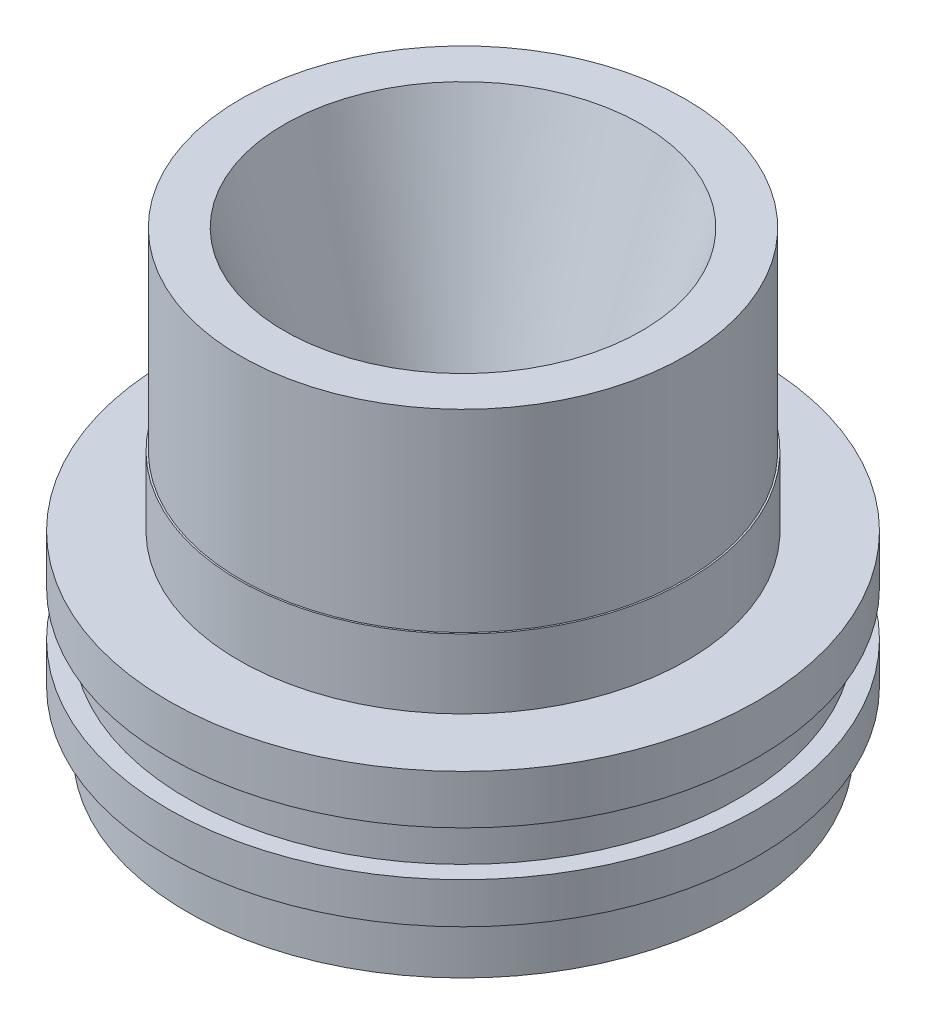
ISO-10303-21;
HEADER;
FILE_DESCRIPTION(('STEP AP214'),'2;1');
FILE_NAME('part.step','',(''),(''),'','','');
FILE_SCHEMA(('AUTOMOTIVE_DESIGN { 1 0 10303 214 1 1 1 1 }'));
ENDSEC;
DATA;
#1=APPLICATION_CONTEXT('core data for automotive mechanical design processes');
#2=APPLICATION_PROTOCOL_DEFINITION('international standard','automotive_design',2000,#1);
#3=PRODUCT_CONTEXT('',#1,'mechanical');
#4=PRODUCT('Part','Part','',(#3));
#5=PRODUCT_RELATED_PRODUCT_CATEGORY('part','',(#4));
#6=PRODUCT_DEFINITION_FORMATION('','',#4);
#7=PRODUCT_DEFINITION_CONTEXT('part definition',#1,'design');
#8=PRODUCT_DEFINITION('design','',#6,#7);
#9=PRODUCT_DEFINITION_SHAPE('','',#8);
#10=(LENGTH_UNIT() NAMED_UNIT(*) SI_UNIT(.MILLI.,.METRE.));
#11=(NAMED_UNIT(*) PLANE_ANGLE_UNIT() SI_UNIT($,.RADIAN.));
#12=(NAMED_UNIT(*) SI_UNIT($,.STERADIAN.) SOLID_ANGLE_UNIT());
#13=UNCERTAINTY_MEASURE_WITH_UNIT(LENGTH_MEASURE(1.E-05),#10,'distance_accuracy_value','');
#14=(GEOMETRIC_REPRESENTATION_CONTEXT(3) GLOBAL_UNCERTAINTY_ASSIGNED_CONTEXT((#13)) GLOBAL_UNIT_ASSIGNED_CONTEXT((#10,
#11,#12)) REPRESENTATION_CONTEXT('',''));
#15=CARTESIAN_POINT('',(0.,0.,0.));
#16=DIRECTION('',(0.,0.,1.));
#17=DIRECTION('',(1.,0.,0.));
#18=AXIS2_PLACEMENT_3D('',#15,#16,#17);
#19=CARTESIAN_POINT('',(0.,0.,0.));
#20=DIRECTION('',(0.,-1.,0.));
#21=DIRECTION('',(0.,0.,-1.));
#22=AXIS2_PLACEMENT_3D('',#19,#20,#21);
#23=CYLINDRICAL_SURFACE('',#22,42.926);
#24=CARTESIAN_POINT('',(0.,-57.9125072160261,0.));
#25=DIRECTION('',(0.,-1.,0.));
#26=DIRECTION('',(0.,0.,-1.));
#27=AXIS2_PLACEMENT_3D('',#24,#25,#26);
#28=CIRCLE('',#27,42.926);
#29=CARTESIAN_POINT('',(0.,-57.9125072160261,-42.926));
#30=VERTEX_POINT('',#29);
#31=EDGE_CURVE('E10',#30,#30,#28,.T.);
#32=ORIENTED_EDGE('',*,*,#31,.F.);
#33=EDGE_LOOP('',(#32));
#34=FACE_BOUND('',#33,.T.);
#35=CARTESIAN_POINT('',(0.,-48.9463072160261,0.));
#36=DIRECTION('',(0.,-1.,0.));
#37=DIRECTION('',(0.,0.,-1.));
#38=AXIS2_PLACEMENT_3D('',#35,#36,#37);
#39=CIRCLE('',#38,42.926);
#40=CARTESIAN_POINT('',(0.,-48.9463072160261,-42.926));
#41=VERTEX_POINT('',#40);
#42=EDGE_CURVE('E88',#41,#41,#39,.T.);
#43=ORIENTED_EDGE('',*,*,#42,.T.);
#44=EDGE_LOOP('',(#43));
#45=FACE_BOUND('',#44,.T.);
#46=ADVANCED_FACE('F34',(#34,#45),#23,.T.);
#47=CARTESIAN_POINT('',(-40.513,-57.9125072160261,0.));
#48=DIRECTION('',(0.,1.,0.));
#49=DIRECTION('',(0.,0.,1.));
#50=AXIS2_PLACEMENT_3D('',#47,#48,#49);
#51=PLANE('',#50);
#52=CARTESIAN_POINT('',(0.,-57.9125072160261,0.));
#53=DIRECTION('',(0.,-1.,0.));
#54=DIRECTION('',(0.,0.,-1.));
#55=AXIS2_PLACEMENT_3D('',#52,#53,#54);
#56=CIRCLE('',#55,40.513);
#57=CARTESIAN_POINT('',(0.,-57.9125072160261,-40.513));
#58=VERTEX_POINT('',#57);
#59=EDGE_CURVE('E40',#58,#58,#56,.T.);
#60=ORIENTED_EDGE('',*,*,#59,.F.);
#61=EDGE_LOOP('',(#60));
#62=FACE_BOUND('',#61,.T.);
#63=ORIENTED_EDGE('',*,*,#31,.T.);
#64=EDGE_LOOP('',(#63));
#65=FACE_BOUND('',#64,.T.);
#66=ADVANCED_FACE('F173',(#62,#65),#51,.F.);
#67=CARTESIAN_POINT('',(0.,-57.9125072160261,0.));
#68=DIRECTION('',(0.,-1.,0.));
#69=DIRECTION('',(0.,0.,-1.));
#70=AXIS2_PLACEMENT_3D('',#67,#68,#69);
#71=CONICAL_SURFACE('',#70,40.513,1.09589215761104);
#72=CARTESIAN_POINT('',(0.,-44.0695072160261,0.));
#73=DIRECTION('',(0.,-1.,0.));
#74=DIRECTION('',(0.,0.,-1.));
#75=AXIS2_PLACEMENT_3D('',#72,#73,#74);
#76=CIRCLE('',#75,13.589);
#77=CARTESIAN_POINT('',(0.,-44.0695072160261,-13.589));
#78=VERTEX_POINT('',#77);
#79=EDGE_CURVE('E44',#78,#78,#76,.T.);
#80=ORIENTED_EDGE('',*,*,#79,.F.);
#81=EDGE_LOOP('',(#80));
#82=FACE_BOUND('',#81,.T.);
#83=ORIENTED_EDGE('',*,*,#59,.T.);
#84=EDGE_LOOP('',(#83));
#85=FACE_BOUND('',#84,.T.);
#86=ADVANCED_FACE('F168',(#82,#85),#71,.F.);
#87=CARTESIAN_POINT('',(0.,0.,0.));
#88=DIRECTION('',(0.,-1.,0.));
#89=DIRECTION('',(0.,0.,-1.));
#90=AXIS2_PLACEMENT_3D('',#87,#88,#89);
#91=CYLINDRICAL_SURFACE('',#90,13.589);
#92=CARTESIAN_POINT('',(0.,-31.3695072160261,0.));
#93=DIRECTION('',(0.,-1.,0.));
#94=DIRECTION('',(0.,0.,-1.));
#95=AXIS2_PLACEMENT_3D('',#92,#93,#94);
#96=CIRCLE('',#95,13.589);
#97=CARTESIAN_POINT('',(0.,-31.3695072160261,-13.589));
#98=VERTEX_POINT('',#97);
#99=EDGE_CURVE('E48',#98,#98,#96,.T.);
#100=ORIENTED_EDGE('',*,*,#99,.F.);
#101=EDGE_LOOP('',(#100));
#102=FACE_BOUND('',#101,.T.);
#103=ORIENTED_EDGE('',*,*,#79,.T.);
#104=EDGE_LOOP('',(#103));
#105=FACE_BOUND('',#104,.T.);
#106=ADVANCED_FACE('F162',(#102,#105),#91,.F.);
#107=CARTESIAN_POINT('',(0.,-31.3695072160261,0.));
#108=DIRECTION('',(0.,1.,0.));
#109=DIRECTION('',(0.,0.,1.));
#110=AXIS2_PLACEMENT_3D('',#107,#108,#109);
#111=CONICAL_SURFACE('',#110,13.589,0.311294124886036);
#112=CARTESIAN_POINT('',(0.,12.9026927839739,0.));
#113=DIRECTION('',(0.,-1.,0.));
#114=DIRECTION('',(0.,0.,-1.));
#115=AXIS2_PLACEMENT_3D('',#112,#113,#114);
#116=CIRCLE('',#115,27.8338022557719);
#117=CARTESIAN_POINT('',(0.,12.9026927839739,-27.8338022557719));
#118=VERTEX_POINT('',#117);
#119=EDGE_CURVE('E53',#118,#118,#116,.T.);
#120=ORIENTED_EDGE('',*,*,#119,.F.);
#121=EDGE_LOOP('',(#120));
#122=FACE_BOUND('',#121,.T.);
#123=ORIENTED_EDGE('',*,*,#99,.T.);
#124=EDGE_LOOP('',(#123));
#125=FACE_BOUND('',#124,.T.);
#126=ADVANCED_FACE('F156',(#122,#125),#111,.F.);
#127=CARTESIAN_POINT('',(-34.6456,12.9026927839739,0.));
#128=DIRECTION('',(0.,-1.,0.));
#129=DIRECTION('',(0.,0.,-1.));
#130=AXIS2_PLACEMENT_3D('',#127,#128,#129);
#131=PLANE('',#130);
#132=CARTESIAN_POINT('',(0.,12.9026927839739,0.));
#133=DIRECTION('',(0.,-1.,0.));
#134=DIRECTION('',(0.,0.,-1.));
#135=AXIS2_PLACEMENT_3D('',#132,#133,#134);
#136=CIRCLE('',#135,34.6456);
#137=CARTESIAN_POINT('',(0.,12.9026927839739,-34.6456));
#138=VERTEX_POINT('',#137);
#139=EDGE_CURVE('E57',#138,#138,#136,.T.);
#140=ORIENTED_EDGE('',*,*,#139,.F.);
#141=EDGE_LOOP('',(#140));
#142=FACE_BOUND('',#141,.T.);
#143=ORIENTED_EDGE('',*,*,#119,.T.);
#144=EDGE_LOOP('',(#143));
#145=FACE_BOUND('',#144,.T.);
#146=ADVANCED_FACE('F150',(#142,#145),#131,.F.);
#147=CARTESIAN_POINT('',(0.,0.,0.));
#148=DIRECTION('',(0.,-1.,0.));
#149=DIRECTION('',(0.,0.,-1.));
#150=AXIS2_PLACEMENT_3D('',#147,#148,#149);
#151=CYLINDRICAL_SURFACE('',#150,34.6456);
#152=CARTESIAN_POINT('',(0.,-17.1963072160261,0.));
#153=DIRECTION('',(0.,-1.,0.));
#154=DIRECTION('',(0.,0.,-1.));
#155=AXIS2_PLACEMENT_3D('',#152,#153,#154);
#156=CIRCLE('',#155,34.6456);
#157=CARTESIAN_POINT('',(0.,-17.1963072160261,-34.6456));
#158=VERTEX_POINT('',#157);
#159=EDGE_CURVE('E61',#158,#158,#156,.T.);
#160=ORIENTED_EDGE('',*,*,#159,.F.);
#161=EDGE_LOOP('',(#160));
#162=FACE_BOUND('',#161,.T.);
#163=ORIENTED_EDGE('',*,*,#139,.T.);
#164=EDGE_LOOP('',(#163));
#165=FACE_BOUND('',#164,.T.);
#166=ADVANCED_FACE('F144',(#162,#165),#151,.T.);
#167=CARTESIAN_POINT('',(-34.8996,-17.1963072160261,0.));
#168=DIRECTION('',(0.,-1.,0.));
#169=DIRECTION('',(0.,0.,-1.));
#170=AXIS2_PLACEMENT_3D('',#167,#168,#169);
#171=PLANE('',#170);
#172=CARTESIAN_POINT('',(0.,-17.1963072160261,0.));
#173=DIRECTION('',(0.,-1.,0.));
#174=DIRECTION('',(0.,0.,-1.));
#175=AXIS2_PLACEMENT_3D('',#172,#173,#174);
#176=CIRCLE('',#175,34.8996);
#177=CARTESIAN_POINT('',(0.,-17.1963072160261,-34.8996));
#178=VERTEX_POINT('',#177);
#179=EDGE_CURVE('E64',#178,#178,#176,.T.);
#180=ORIENTED_EDGE('',*,*,#179,.F.);
#181=EDGE_LOOP('',(#180));
#182=FACE_BOUND('',#181,.T.);
#183=ORIENTED_EDGE('',*,*,#159,.T.);
#184=EDGE_LOOP('',(#183));
#185=FACE_BOUND('',#184,.T.);
#186=ADVANCED_FACE('F138',(#182,#185),#171,.F.);
#187=CARTESIAN_POINT('',(0.,0.,0.));
#188=DIRECTION('',(0.,-1.,0.));
#189=DIRECTION('',(0.,0.,-1.));
#190=AXIS2_PLACEMENT_3D('',#187,#188,#189);
#191=CYLINDRICAL_SURFACE('',#190,34.8996);
#192=CARTESIAN_POINT('',(0.,-27.9913072160261,0.));
#193=DIRECTION('',(0.,-1.,0.));
#194=DIRECTION('',(0.,0.,-1.));
#195=AXIS2_PLACEMENT_3D('',#192,#193,#194);
#196=CIRCLE('',#195,34.8996);
#197=CARTESIAN_POINT('',(0.,-27.9913072160261,-34.8996));
#198=VERTEX_POINT('',#197);
#199=EDGE_CURVE('E67',#198,#198,#196,.T.);
#200=ORIENTED_EDGE('',*,*,#199,.F.);
#201=EDGE_LOOP('',(#200));
#202=FACE_BOUND('',#201,.T.);
#203=ORIENTED_EDGE('',*,*,#179,.T.);
#204=EDGE_LOOP('',(#203));
#205=FACE_BOUND('',#204,.T.);
#206=ADVANCED_FACE('F132',(#202,#205),#191,.T.);
#207=CARTESIAN_POINT('',(-45.847,-27.9913072160261,0.));
#208=DIRECTION('',(0.,-1.,0.));
#209=DIRECTION('',(0.,0.,-1.));
#210=AXIS2_PLACEMENT_3D('',#207,#208,#209);
#211=PLANE('',#210);
#212=CARTESIAN_POINT('',(0.,-27.9913072160261,0.));
#213=DIRECTION('',(0.,-1.,0.));
#214=DIRECTION('',(0.,0.,-1.));
#215=AXIS2_PLACEMENT_3D('',#212,#213,#214);
#216=CIRCLE('',#215,45.847);
#217=CARTESIAN_POINT('',(0.,-27.9913072160261,-45.847));
#218=VERTEX_POINT('',#217);
#219=EDGE_CURVE('E70',#218,#218,#216,.T.);
#220=ORIENTED_EDGE('',*,*,#219,.F.);
#221=EDGE_LOOP('',(#220));
#222=FACE_BOUND('',#221,.T.);
#223=ORIENTED_EDGE('',*,*,#199,.T.);
#224=EDGE_LOOP('',(#223));
#225=FACE_BOUND('',#224,.T.);
#226=ADVANCED_FACE('F126',(#222,#225),#211,.F.);
#227=CARTESIAN_POINT('',(0.,0.,0.));
#228=DIRECTION('',(0.,-1.,0.));
#229=DIRECTION('',(0.,0.,-1.));
#230=AXIS2_PLACEMENT_3D('',#227,#228,#229);
#231=CYLINDRICAL_SURFACE('',#230,45.847);
#232=CARTESIAN_POINT('',(0.,-35.6113072160261,0.));
#233=DIRECTION('',(0.,-1.,0.));
#234=DIRECTION('',(0.,0.,-1.));
#235=AXIS2_PLACEMENT_3D('',#232,#233,#234);
#236=CIRCLE('',#235,45.847);
#237=CARTESIAN_POINT('',(0.,-35.6113072160261,-45.847));
#238=VERTEX_POINT('',#237);
#239=EDGE_CURVE('E73',#238,#238,#236,.T.);
#240=ORIENTED_EDGE('',*,*,#239,.F.);
#241=EDGE_LOOP('',(#240));
#242=FACE_BOUND('',#241,.T.);
#243=ORIENTED_EDGE('',*,*,#219,.T.);
#244=EDGE_LOOP('',(#243));
#245=FACE_BOUND('',#244,.T.);
#246=ADVANCED_FACE('F120',(#242,#245),#231,.T.);
#247=CARTESIAN_POINT('',(-42.926,-35.6113072160261,0.));
#248=DIRECTION('',(0.,1.,0.));
#249=DIRECTION('',(0.,0.,1.));
#250=AXIS2_PLACEMENT_3D('',#247,#248,#249);
#251=PLANE('',#250);
#252=CARTESIAN_POINT('',(0.,-35.6113072160261,0.));
#253=DIRECTION('',(0.,-1.,0.));
#254=DIRECTION('',(0.,0.,-1.));
#255=AXIS2_PLACEMENT_3D('',#252,#253,#254);
#256=CIRCLE('',#255,42.926);
#257=CARTESIAN_POINT('',(0.,-35.6113072160261,-42.926));
#258=VERTEX_POINT('',#257);
#259=EDGE_CURVE('E76',#258,#258,#256,.T.);
#260=ORIENTED_EDGE('',*,*,#259,.F.);
#261=EDGE_LOOP('',(#260));
#262=FACE_BOUND('',#261,.T.);
#263=ORIENTED_EDGE('',*,*,#239,.T.);
#264=EDGE_LOOP('',(#263));
#265=FACE_BOUND('',#264,.T.);
#266=ADVANCED_FACE('F114',(#262,#265),#251,.F.);
#267=CARTESIAN_POINT('',(0.,0.,0.));
#268=DIRECTION('',(0.,-1.,0.));
#269=DIRECTION('',(0.,0.,-1.));
#270=AXIS2_PLACEMENT_3D('',#267,#268,#269);
#271=CYLINDRICAL_SURFACE('',#270,42.926);
#272=CARTESIAN_POINT('',(0.,-42.5963072160261,0.));
#273=DIRECTION('',(0.,-1.,0.));
#274=DIRECTION('',(0.,0.,-1.));
#275=AXIS2_PLACEMENT_3D('',#272,#273,#274);
#276=CIRCLE('',#275,42.926);
#277=CARTESIAN_POINT('',(0.,-42.5963072160261,-42.926));
#278=VERTEX_POINT('',#277);
#279=EDGE_CURVE('E79',#278,#278,#276,.T.);
#280=ORIENTED_EDGE('',*,*,#279,.F.);
#281=EDGE_LOOP('',(#280));
#282=FACE_BOUND('',#281,.T.);
#283=ORIENTED_EDGE('',*,*,#259,.T.);
#284=EDGE_LOOP('',(#283));
#285=FACE_BOUND('',#284,.T.);
#286=ADVANCED_FACE('F108',(#282,#285),#271,.T.);
#287=CARTESIAN_POINT('',(-45.847,-42.5963072160261,0.));
#288=DIRECTION('',(0.,-1.,0.));
#289=DIRECTION('',(0.,0.,-1.));
#290=AXIS2_PLACEMENT_3D('',#287,#288,#289);
#291=PLANE('',#290);
#292=CARTESIAN_POINT('',(0.,-42.5963072160261,0.));
#293=DIRECTION('',(0.,-1.,0.));
#294=DIRECTION('',(0.,0.,-1.));
#295=AXIS2_PLACEMENT_3D('',#292,#293,#294);
#296=CIRCLE('',#295,45.847);
#297=CARTESIAN_POINT('',(0.,-42.5963072160261,-45.847));
#298=VERTEX_POINT('',#297);
#299=EDGE_CURVE('E82',#298,#298,#296,.T.);
#300=ORIENTED_EDGE('',*,*,#299,.F.);
#301=EDGE_LOOP('',(#300));
#302=FACE_BOUND('',#301,.T.);
#303=ORIENTED_EDGE('',*,*,#279,.T.);
#304=EDGE_LOOP('',(#303));
#305=FACE_BOUND('',#304,.T.);
#306=ADVANCED_FACE('F102',(#302,#305),#291,.F.);
#307=CARTESIAN_POINT('',(0.,0.,0.));
#308=DIRECTION('',(0.,-1.,0.));
#309=DIRECTION('',(0.,0.,-1.));
#310=AXIS2_PLACEMENT_3D('',#307,#308,#309);
#311=CYLINDRICAL_SURFACE('',#310,45.847);
#312=CARTESIAN_POINT('',(0.,-48.9463072160261,0.));
#313=DIRECTION('',(0.,-1.,0.));
#314=DIRECTION('',(0.,0.,-1.));
#315=AXIS2_PLACEMENT_3D('',#312,#313,#314);
#316=CIRCLE('',#315,45.847);
#317=CARTESIAN_POINT('',(0.,-48.9463072160261,-45.847));
#318=VERTEX_POINT('',#317);
#319=EDGE_CURVE('E85',#318,#318,#316,.T.);
#320=ORIENTED_EDGE('',*,*,#319,.F.);
#321=EDGE_LOOP('',(#320));
#322=FACE_BOUND('',#321,.T.);
#323=ORIENTED_EDGE('',*,*,#299,.T.);
#324=EDGE_LOOP('',(#323));
#325=FACE_BOUND('',#324,.T.);
#326=ADVANCED_FACE('F96',(#322,#325),#311,.T.);
#327=CARTESIAN_POINT('',(-42.926,-48.9463072160261,0.));
#328=DIRECTION('',(0.,1.,0.));
#329=DIRECTION('',(0.,0.,1.));
#330=AXIS2_PLACEMENT_3D('',#327,#328,#329);
#331=PLANE('',#330);
#332=ORIENTED_EDGE('',*,*,#42,.F.);
#333=EDGE_LOOP('',(#332));
#334=FACE_BOUND('',#333,.T.);
#335=ORIENTED_EDGE('',*,*,#319,.T.);
#336=EDGE_LOOP('',(#335));
#337=FACE_BOUND('',#336,.T.);
#338=ADVANCED_FACE('F93',(#334,#337),#331,.F.);
#339=CLOSED_SHELL('',(#46,#66,#86,#106,#126,#146,#166,#186,#206,#226,#246,#266,#286,#306,#326,#338));
#340=MANIFOLD_SOLID_BREP('B2',#339);
#341=ADVANCED_BREP_SHAPE_REPRESENTATION('',(#18,#340),#14);
#342=SHAPE_DEFINITION_REPRESENTATION(#9,#341);
ENDSEC;
END-ISO-10303-21;
